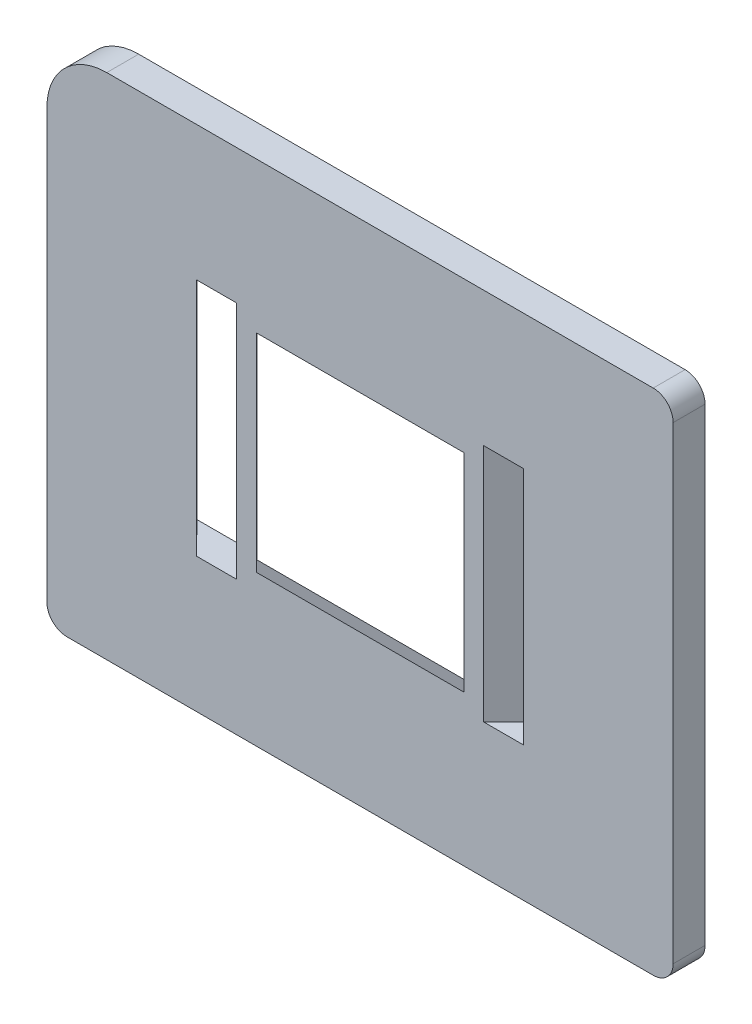
ISO-10303-21;
HEADER;
FILE_DESCRIPTION(('STEP AP214'),'2;1');
FILE_NAME('part.step','',(''),(''),'','','');
FILE_SCHEMA(('AUTOMOTIVE_DESIGN { 1 0 10303 214 1 1 1 1 }'));
ENDSEC;
DATA;
#1=APPLICATION_CONTEXT('core data for automotive mechanical design processes');
#2=APPLICATION_PROTOCOL_DEFINITION('international standard','automotive_design',2000,#1);
#3=PRODUCT_CONTEXT('',#1,'mechanical');
#4=PRODUCT('Part','Part','',(#3));
#5=PRODUCT_RELATED_PRODUCT_CATEGORY('part','',(#4));
#6=PRODUCT_DEFINITION_FORMATION('','',#4);
#7=PRODUCT_DEFINITION_CONTEXT('part definition',#1,'design');
#8=PRODUCT_DEFINITION('design','',#6,#7);
#9=PRODUCT_DEFINITION_SHAPE('','',#8);
#10=(LENGTH_UNIT() NAMED_UNIT(*) SI_UNIT(.MILLI.,.METRE.));
#11=(NAMED_UNIT(*) PLANE_ANGLE_UNIT() SI_UNIT($,.RADIAN.));
#12=(NAMED_UNIT(*) SI_UNIT($,.STERADIAN.) SOLID_ANGLE_UNIT());
#13=UNCERTAINTY_MEASURE_WITH_UNIT(LENGTH_MEASURE(1.E-05),#10,'distance_accuracy_value','');
#14=(GEOMETRIC_REPRESENTATION_CONTEXT(3) GLOBAL_UNCERTAINTY_ASSIGNED_CONTEXT((#13)) GLOBAL_UNIT_ASSIGNED_CONTEXT((#10,
#11,#12)) REPRESENTATION_CONTEXT('',''));
#15=CARTESIAN_POINT('',(0.,0.,0.));
#16=DIRECTION('',(0.,0.,1.));
#17=DIRECTION('',(1.,0.,0.));
#18=AXIS2_PLACEMENT_3D('',#15,#16,#17);
#19=CARTESIAN_POINT('',(0.,0.,4.));
#20=DIRECTION('',(0.,0.,-1.));
#21=DIRECTION('',(-1.,0.,0.));
#22=AXIS2_PLACEMENT_3D('',#19,#20,#21);
#23=PLANE('',#22);
#24=DIRECTION('',(-1.,0.,0.));
#25=VECTOR('',#24,1.);
#26=CARTESIAN_POINT('',(-31.,30.,4.));
#27=LINE('',#26,#25);
#28=CARTESIAN_POINT('',(-31.,30.,4.));
#29=VERTEX_POINT('',#28);
#30=CARTESIAN_POINT('',(-41.,30.,4.));
#31=VERTEX_POINT('',#30);
#32=EDGE_CURVE('E325',#29,#31,#27,.T.);
#33=ORIENTED_EDGE('',*,*,#32,.F.);
#34=DIRECTION('',(0.,1.,0.));
#35=VECTOR('',#34,1.);
#36=CARTESIAN_POINT('',(-31.,30.,4.));
#37=LINE('',#36,#35);
#38=CARTESIAN_POINT('',(-31.,-30.,4.));
#39=VERTEX_POINT('',#38);
#40=EDGE_CURVE('E319',#39,#29,#37,.T.);
#41=ORIENTED_EDGE('',*,*,#40,.F.);
#42=DIRECTION('',(1.,0.,0.));
#43=VECTOR('',#42,1.);
#44=CARTESIAN_POINT('',(-31.,-30.,4.));
#45=LINE('',#44,#43);
#46=CARTESIAN_POINT('',(-41.,-30.,4.));
#47=VERTEX_POINT('',#46);
#48=EDGE_CURVE('E316',#47,#39,#45,.T.);
#49=ORIENTED_EDGE('',*,*,#48,.F.);
#50=DIRECTION('',(0.,-1.,0.));
#51=VECTOR('',#50,1.);
#52=CARTESIAN_POINT('',(-41.,30.,4.));
#53=LINE('',#52,#51);
#54=EDGE_CURVE('E318',#31,#47,#53,.T.);
#55=ORIENTED_EDGE('',*,*,#54,.F.);
#56=EDGE_LOOP('',(#33,#41,#49,#55));
#57=FACE_BOUND('',#56,.T.);
#58=DIRECTION('',(1.,0.,0.));
#59=VECTOR('',#58,1.);
#60=CARTESIAN_POINT('',(-26.,-26.,4.));
#61=LINE('',#60,#59);
#62=CARTESIAN_POINT('',(-26.,-26.,4.));
#63=VERTEX_POINT('',#62);
#64=CARTESIAN_POINT('',(26.,-26.,4.));
#65=VERTEX_POINT('',#64);
#66=EDGE_CURVE('E591',#63,#65,#61,.T.);
#67=ORIENTED_EDGE('',*,*,#66,.F.);
#68=DIRECTION('',(0.,-1.,0.));
#69=VECTOR('',#68,1.);
#70=CARTESIAN_POINT('',(-26.,-26.,4.));
#71=LINE('',#70,#69);
#72=CARTESIAN_POINT('',(-26.,26.,4.));
#73=VERTEX_POINT('',#72);
#74=EDGE_CURVE('E536',#73,#63,#71,.T.);
#75=ORIENTED_EDGE('',*,*,#74,.F.);
#76=DIRECTION('',(-1.,0.,0.));
#77=VECTOR('',#76,1.);
#78=CARTESIAN_POINT('',(-26.,26.,4.));
#79=LINE('',#78,#77);
#80=CARTESIAN_POINT('',(26.,26.,4.));
#81=VERTEX_POINT('',#80);
#82=EDGE_CURVE('E569',#81,#73,#79,.T.);
#83=ORIENTED_EDGE('',*,*,#82,.F.);
#84=DIRECTION('',(0.,1.,0.));
#85=VECTOR('',#84,1.);
#86=CARTESIAN_POINT('',(26.,-26.,4.));
#87=LINE('',#86,#85);
#88=EDGE_CURVE('E566',#65,#81,#87,.T.);
#89=ORIENTED_EDGE('',*,*,#88,.F.);
#90=EDGE_LOOP('',(#67,#75,#83,#89));
#91=FACE_BOUND('',#90,.T.);
#92=DIRECTION('',(0.,-1.,0.));
#93=VECTOR('',#92,1.);
#94=CARTESIAN_POINT('',(-78.5,-63.75,4.));
#95=LINE('',#94,#93);
#96=CARTESIAN_POINT('',(-78.5,48.75,4.));
#97=VERTEX_POINT('',#96);
#98=CARTESIAN_POINT('',(-78.5,-58.75,4.));
#99=VERTEX_POINT('',#98);
#100=EDGE_CURVE('E622',#97,#99,#95,.T.);
#101=ORIENTED_EDGE('',*,*,#100,.T.);
#102=CARTESIAN_POINT('',(-73.5,-58.75,4.));
#103=DIRECTION('',(0.,0.,-1.));
#104=DIRECTION('',(-1.,0.,0.));
#105=AXIS2_PLACEMENT_3D('',#102,#103,#104);
#106=CIRCLE('',#105,5.);
#107=CARTESIAN_POINT('',(-73.5,-63.75,4.));
#108=VERTEX_POINT('',#107);
#109=EDGE_CURVE('E666',#99,#108,#106,.F.);
#110=ORIENTED_EDGE('',*,*,#109,.T.);
#111=DIRECTION('',(1.,0.,0.));
#112=VECTOR('',#111,1.);
#113=CARTESIAN_POINT('',(-78.5,-63.75,4.));
#114=LINE('',#113,#112);
#115=CARTESIAN_POINT('',(73.5,-63.75,4.));
#116=VERTEX_POINT('',#115);
#117=EDGE_CURVE('E585',#108,#116,#114,.T.);
#118=ORIENTED_EDGE('',*,*,#117,.T.);
#119=CARTESIAN_POINT('',(73.5,-58.75,4.));
#120=DIRECTION('',(0.,0.,-1.));
#121=DIRECTION('',(-1.,0.,0.));
#122=AXIS2_PLACEMENT_3D('',#119,#120,#121);
#123=CIRCLE('',#122,5.);
#124=CARTESIAN_POINT('',(78.5,-58.75,4.));
#125=VERTEX_POINT('',#124);
#126=EDGE_CURVE('E647',#116,#125,#123,.F.);
#127=ORIENTED_EDGE('',*,*,#126,.T.);
#128=DIRECTION('',(0.,1.,0.));
#129=VECTOR('',#128,1.);
#130=CARTESIAN_POINT('',(78.5,-63.75,4.));
#131=LINE('',#130,#129);
#132=CARTESIAN_POINT('',(78.5,58.75,4.));
#133=VERTEX_POINT('',#132);
#134=EDGE_CURVE('E617',#125,#133,#131,.T.);
#135=ORIENTED_EDGE('',*,*,#134,.T.);
#136=CARTESIAN_POINT('',(73.5,58.75,4.));
#137=DIRECTION('',(0.,0.,-1.));
#138=DIRECTION('',(-1.,0.,0.));
#139=AXIS2_PLACEMENT_3D('',#136,#137,#138);
#140=CIRCLE('',#139,5.);
#141=CARTESIAN_POINT('',(73.5,63.75,4.));
#142=VERTEX_POINT('',#141);
#143=EDGE_CURVE('E82',#133,#142,#140,.F.);
#144=ORIENTED_EDGE('',*,*,#143,.T.);
#145=DIRECTION('',(-1.,0.,0.));
#146=VECTOR('',#145,1.);
#147=CARTESIAN_POINT('',(-78.5,63.75,4.));
#148=LINE('',#147,#146);
#149=CARTESIAN_POINT('',(-63.5,63.75,4.));
#150=VERTEX_POINT('',#149);
#151=EDGE_CURVE('E619',#142,#150,#148,.T.);
#152=ORIENTED_EDGE('',*,*,#151,.T.);
#153=CARTESIAN_POINT('',(-63.5,48.75,4.));
#154=DIRECTION('',(0.,0.,-1.));
#155=DIRECTION('',(-1.,0.,0.));
#156=AXIS2_PLACEMENT_3D('',#153,#154,#155);
#157=CIRCLE('',#156,15.);
#158=EDGE_CURVE('E662',#150,#97,#157,.F.);
#159=ORIENTED_EDGE('',*,*,#158,.T.);
#160=EDGE_LOOP('',(#101,#110,#118,#127,#135,#144,#152,#159));
#161=FACE_BOUND('',#160,.T.);
#162=DIRECTION('',(1.,0.,0.));
#163=VECTOR('',#162,1.);
#164=CARTESIAN_POINT('',(31.,30.,4.));
#165=LINE('',#164,#163);
#166=CARTESIAN_POINT('',(31.,30.,4.));
#167=VERTEX_POINT('',#166);
#168=CARTESIAN_POINT('',(41.,30.,4.));
#169=VERTEX_POINT('',#168);
#170=EDGE_CURVE('E215',#167,#169,#165,.T.);
#171=ORIENTED_EDGE('',*,*,#170,.T.);
#172=DIRECTION('',(0.,-1.,0.));
#173=VECTOR('',#172,1.);
#174=CARTESIAN_POINT('',(41.,30.,4.));
#175=LINE('',#174,#173);
#176=CARTESIAN_POINT('',(41.,-30.,4.));
#177=VERTEX_POINT('',#176);
#178=EDGE_CURVE('E221',#169,#177,#175,.T.);
#179=ORIENTED_EDGE('',*,*,#178,.T.);
#180=DIRECTION('',(-1.,0.,0.));
#181=VECTOR('',#180,1.);
#182=CARTESIAN_POINT('',(31.,-30.,4.));
#183=LINE('',#182,#181);
#184=CARTESIAN_POINT('',(31.,-30.,4.));
#185=VERTEX_POINT('',#184);
#186=EDGE_CURVE('E226',#177,#185,#183,.T.);
#187=ORIENTED_EDGE('',*,*,#186,.T.);
#188=DIRECTION('',(0.,1.,0.));
#189=VECTOR('',#188,1.);
#190=CARTESIAN_POINT('',(31.,30.,4.));
#191=LINE('',#190,#189);
#192=EDGE_CURVE('E202',#185,#167,#191,.T.);
#193=ORIENTED_EDGE('',*,*,#192,.T.);
#194=EDGE_LOOP('',(#171,#179,#187,#193));
#195=FACE_BOUND('',#194,.T.);
#196=ADVANCED_FACE('F61',(#57,#91,#161,#195),#23,.F.);
#197=CARTESIAN_POINT('',(0.,0.,-4.));
#198=DIRECTION('',(0.,0.,-1.));
#199=DIRECTION('',(-1.,0.,0.));
#200=AXIS2_PLACEMENT_3D('',#197,#198,#199);
#201=PLANE('',#200);
#202=DIRECTION('',(0.,-1.,0.));
#203=VECTOR('',#202,1.);
#204=CARTESIAN_POINT('',(-38.8947368421052,30.,-4.));
#205=LINE('',#204,#203);
#206=CARTESIAN_POINT('',(-38.8947368421052,30.,-4.));
#207=VERTEX_POINT('',#206);
#208=CARTESIAN_POINT('',(-38.8947368421052,-30.,-4.));
#209=VERTEX_POINT('',#208);
#210=EDGE_CURVE('E220',#207,#209,#205,.T.);
#211=ORIENTED_EDGE('',*,*,#210,.F.);
#212=DIRECTION('',(1.,0.,0.));
#213=VECTOR('',#212,1.);
#214=CARTESIAN_POINT('',(-38.8947368421052,30.,-4.));
#215=LINE('',#214,#213);
#216=CARTESIAN_POINT('',(-48.8947368421052,30.,-4.));
#217=VERTEX_POINT('',#216);
#218=EDGE_CURVE('E302',#217,#207,#215,.T.);
#219=ORIENTED_EDGE('',*,*,#218,.F.);
#220=DIRECTION('',(0.,1.,0.));
#221=VECTOR('',#220,1.);
#222=CARTESIAN_POINT('',(-48.8947368421052,30.,-4.));
#223=LINE('',#222,#221);
#224=CARTESIAN_POINT('',(-48.8947368421052,-30.,-4.));
#225=VERTEX_POINT('',#224);
#226=EDGE_CURVE('E296',#225,#217,#223,.T.);
#227=ORIENTED_EDGE('',*,*,#226,.F.);
#228=DIRECTION('',(-1.,0.,0.));
#229=VECTOR('',#228,1.);
#230=CARTESIAN_POINT('',(-38.8947368421052,-30.,-4.));
#231=LINE('',#230,#229);
#232=EDGE_CURVE('E288',#209,#225,#231,.T.);
#233=ORIENTED_EDGE('',*,*,#232,.F.);
#234=EDGE_LOOP('',(#211,#219,#227,#233));
#235=FACE_BOUND('',#234,.T.);
#236=DIRECTION('',(0.,1.,0.));
#237=VECTOR('',#236,1.);
#238=CARTESIAN_POINT('',(-33.8947368421053,0.,-4.));
#239=LINE('',#238,#237);
#240=CARTESIAN_POINT('',(-33.8947368421052,-31.221052631579,-4.));
#241=VERTEX_POINT('',#240);
#242=CARTESIAN_POINT('',(-33.8947368421053,31.2210526315789,-4.));
#243=VERTEX_POINT('',#242);
#244=EDGE_CURVE('E580',#241,#243,#239,.T.);
#245=ORIENTED_EDGE('',*,*,#244,.F.);
#246=DIRECTION('',(-1.,0.,0.));
#247=VECTOR('',#246,1.);
#248=CARTESIAN_POINT('',(0.,-31.221052631579,-4.));
#249=LINE('',#248,#247);
#250=CARTESIAN_POINT('',(33.8947368421053,-31.2210526315789,-4.));
#251=VERTEX_POINT('',#250);
#252=EDGE_CURVE('E582',#251,#241,#249,.T.);
#253=ORIENTED_EDGE('',*,*,#252,.F.);
#254=DIRECTION('',(0.,-1.,0.));
#255=VECTOR('',#254,1.);
#256=CARTESIAN_POINT('',(33.8947368421053,0.,-4.));
#257=LINE('',#256,#255);
#258=CARTESIAN_POINT('',(33.8947368421053,31.221052631579,-4.));
#259=VERTEX_POINT('',#258);
#260=EDGE_CURVE('E581',#259,#251,#257,.T.);
#261=ORIENTED_EDGE('',*,*,#260,.F.);
#262=DIRECTION('',(1.,0.,0.));
#263=VECTOR('',#262,1.);
#264=CARTESIAN_POINT('',(0.,31.2210526315789,-4.));
#265=LINE('',#264,#263);
#266=EDGE_CURVE('E575',#243,#259,#265,.T.);
#267=ORIENTED_EDGE('',*,*,#266,.F.);
#268=EDGE_LOOP('',(#245,#253,#261,#267));
#269=FACE_BOUND('',#268,.T.);
#270=DIRECTION('',(1.,0.,0.));
#271=VECTOR('',#270,1.);
#272=CARTESIAN_POINT('',(-78.5,-63.75,-4.));
#273=LINE('',#272,#271);
#274=CARTESIAN_POINT('',(-73.5,-63.75,-4.));
#275=VERTEX_POINT('',#274);
#276=CARTESIAN_POINT('',(73.5,-63.75,-4.));
#277=VERTEX_POINT('',#276);
#278=EDGE_CURVE('E620',#275,#277,#273,.T.);
#279=ORIENTED_EDGE('',*,*,#278,.F.);
#280=CARTESIAN_POINT('',(-73.5,-58.75,-4.));
#281=DIRECTION('',(0.,0.,-1.));
#282=DIRECTION('',(-1.,0.,0.));
#283=AXIS2_PLACEMENT_3D('',#280,#281,#282);
#284=CIRCLE('',#283,5.);
#285=CARTESIAN_POINT('',(-78.5,-58.75,-4.));
#286=VERTEX_POINT('',#285);
#287=EDGE_CURVE('E655',#275,#286,#284,.T.);
#288=ORIENTED_EDGE('',*,*,#287,.T.);
#289=DIRECTION('',(0.,-1.,0.));
#290=VECTOR('',#289,1.);
#291=CARTESIAN_POINT('',(-78.5,-63.75,-4.));
#292=LINE('',#291,#290);
#293=CARTESIAN_POINT('',(-78.5,48.75,-4.));
#294=VERTEX_POINT('',#293);
#295=EDGE_CURVE('E631',#294,#286,#292,.T.);
#296=ORIENTED_EDGE('',*,*,#295,.F.);
#297=CARTESIAN_POINT('',(-63.5,48.75,-4.));
#298=DIRECTION('',(0.,0.,-1.));
#299=DIRECTION('',(-1.,0.,0.));
#300=AXIS2_PLACEMENT_3D('',#297,#298,#299);
#301=CIRCLE('',#300,15.);
#302=CARTESIAN_POINT('',(-63.5,63.75,-4.));
#303=VERTEX_POINT('',#302);
#304=EDGE_CURVE('E648',#294,#303,#301,.T.);
#305=ORIENTED_EDGE('',*,*,#304,.T.);
#306=DIRECTION('',(-1.,0.,0.));
#307=VECTOR('',#306,1.);
#308=CARTESIAN_POINT('',(-78.5,63.75,-4.));
#309=LINE('',#308,#307);
#310=CARTESIAN_POINT('',(73.5,63.75,-4.));
#311=VERTEX_POINT('',#310);
#312=EDGE_CURVE('E629',#311,#303,#309,.T.);
#313=ORIENTED_EDGE('',*,*,#312,.F.);
#314=CARTESIAN_POINT('',(73.5,58.75,-4.));
#315=DIRECTION('',(0.,0.,-1.));
#316=DIRECTION('',(-1.,0.,0.));
#317=AXIS2_PLACEMENT_3D('',#314,#315,#316);
#318=CIRCLE('',#317,5.);
#319=CARTESIAN_POINT('',(78.5,58.75,-4.));
#320=VERTEX_POINT('',#319);
#321=EDGE_CURVE('E652',#311,#320,#318,.T.);
#322=ORIENTED_EDGE('',*,*,#321,.T.);
#323=DIRECTION('',(0.,1.,0.));
#324=VECTOR('',#323,1.);
#325=CARTESIAN_POINT('',(78.5,-63.75,-4.));
#326=LINE('',#325,#324);
#327=CARTESIAN_POINT('',(78.5,-58.75,-4.));
#328=VERTEX_POINT('',#327);
#329=EDGE_CURVE('E612',#328,#320,#326,.T.);
#330=ORIENTED_EDGE('',*,*,#329,.F.);
#331=CARTESIAN_POINT('',(73.5,-58.75,-4.));
#332=DIRECTION('',(0.,0.,-1.));
#333=DIRECTION('',(-1.,0.,0.));
#334=AXIS2_PLACEMENT_3D('',#331,#332,#333);
#335=CIRCLE('',#334,5.);
#336=EDGE_CURVE('E645',#328,#277,#335,.T.);
#337=ORIENTED_EDGE('',*,*,#336,.T.);
#338=EDGE_LOOP('',(#279,#288,#296,#305,#313,#322,#330,#337));
#339=FACE_BOUND('',#338,.T.);
#340=DIRECTION('',(0.,1.,0.));
#341=VECTOR('',#340,1.);
#342=CARTESIAN_POINT('',(48.8947368421052,30.,-4.));
#343=LINE('',#342,#341);
#344=CARTESIAN_POINT('',(48.8947368421052,-30.,-4.));
#345=VERTEX_POINT('',#344);
#346=CARTESIAN_POINT('',(48.8947368421052,30.,-4.));
#347=VERTEX_POINT('',#346);
#348=EDGE_CURVE('E433',#345,#347,#343,.T.);
#349=ORIENTED_EDGE('',*,*,#348,.T.);
#350=DIRECTION('',(-1.,0.,0.));
#351=VECTOR('',#350,1.);
#352=CARTESIAN_POINT('',(38.8947368421052,30.,-4.));
#353=LINE('',#352,#351);
#354=CARTESIAN_POINT('',(38.8947368421052,30.,-4.));
#355=VERTEX_POINT('',#354);
#356=EDGE_CURVE('E485',#347,#355,#353,.T.);
#357=ORIENTED_EDGE('',*,*,#356,.T.);
#358=DIRECTION('',(0.,-1.,0.));
#359=VECTOR('',#358,1.);
#360=CARTESIAN_POINT('',(38.8947368421052,30.,-4.));
#361=LINE('',#360,#359);
#362=CARTESIAN_POINT('',(38.8947368421052,-30.,-4.));
#363=VERTEX_POINT('',#362);
#364=EDGE_CURVE('E206',#355,#363,#361,.T.);
#365=ORIENTED_EDGE('',*,*,#364,.T.);
#366=DIRECTION('',(1.,0.,0.));
#367=VECTOR('',#366,1.);
#368=CARTESIAN_POINT('',(38.8947368421052,-30.,-4.));
#369=LINE('',#368,#367);
#370=EDGE_CURVE('E432',#363,#345,#369,.T.);
#371=ORIENTED_EDGE('',*,*,#370,.T.);
#372=EDGE_LOOP('',(#349,#357,#365,#371));
#373=FACE_BOUND('',#372,.T.);
#374=ADVANCED_FACE('F247',(#235,#269,#339,#373),#201,.T.);
#375=CARTESIAN_POINT('',(78.5,-63.75,4.));
#376=DIRECTION('',(-1.,0.,0.));
#377=DIRECTION('',(0.,0.,1.));
#378=AXIS2_PLACEMENT_3D('',#375,#376,#377);
#379=PLANE('',#378);
#380=ORIENTED_EDGE('',*,*,#134,.F.);
#381=DIRECTION('',(0.,0.,-1.));
#382=VECTOR('',#381,1.);
#383=CARTESIAN_POINT('',(78.5,-58.75,4.));
#384=LINE('',#383,#382);
#385=EDGE_CURVE('E670',#125,#328,#384,.T.);
#386=ORIENTED_EDGE('',*,*,#385,.T.);
#387=ORIENTED_EDGE('',*,*,#329,.T.);
#388=DIRECTION('',(0.,0.,-1.));
#389=VECTOR('',#388,1.);
#390=CARTESIAN_POINT('',(78.5,58.75,4.));
#391=LINE('',#390,#389);
#392=EDGE_CURVE('E668',#320,#133,#391,.F.);
#393=ORIENTED_EDGE('',*,*,#392,.T.);
#394=EDGE_LOOP('',(#380,#386,#387,#393));
#395=FACE_BOUND('',#394,.T.);
#396=ADVANCED_FACE('F674',(#395),#379,.F.);
#397=CARTESIAN_POINT('',(-78.5,63.75,4.));
#398=DIRECTION('',(0.,-1.,0.));
#399=DIRECTION('',(0.,0.,-1.));
#400=AXIS2_PLACEMENT_3D('',#397,#398,#399);
#401=PLANE('',#400);
#402=ORIENTED_EDGE('',*,*,#151,.F.);
#403=DIRECTION('',(0.,0.,-1.));
#404=VECTOR('',#403,1.);
#405=CARTESIAN_POINT('',(73.5,63.75,4.));
#406=LINE('',#405,#404);
#407=EDGE_CURVE('E13',#142,#311,#406,.T.);
#408=ORIENTED_EDGE('',*,*,#407,.T.);
#409=ORIENTED_EDGE('',*,*,#312,.T.);
#410=DIRECTION('',(0.,0.,-1.));
#411=VECTOR('',#410,1.);
#412=CARTESIAN_POINT('',(-63.5,63.75,4.));
#413=LINE('',#412,#411);
#414=EDGE_CURVE('E69',#303,#150,#413,.F.);
#415=ORIENTED_EDGE('',*,*,#414,.T.);
#416=EDGE_LOOP('',(#402,#408,#409,#415));
#417=FACE_BOUND('',#416,.T.);
#418=ADVANCED_FACE('F680',(#417),#401,.F.);
#419=CARTESIAN_POINT('',(-78.5,-63.75,4.));
#420=DIRECTION('',(1.,0.,0.));
#421=DIRECTION('',(0.,0.,-1.));
#422=AXIS2_PLACEMENT_3D('',#419,#420,#421);
#423=PLANE('',#422);
#424=ORIENTED_EDGE('',*,*,#295,.T.);
#425=DIRECTION('',(0.,0.,-1.));
#426=VECTOR('',#425,1.);
#427=CARTESIAN_POINT('',(-78.5,-58.75,4.));
#428=LINE('',#427,#426);
#429=EDGE_CURVE('E660',#286,#99,#428,.F.);
#430=ORIENTED_EDGE('',*,*,#429,.T.);
#431=ORIENTED_EDGE('',*,*,#100,.F.);
#432=DIRECTION('',(0.,0.,-1.));
#433=VECTOR('',#432,1.);
#434=CARTESIAN_POINT('',(-78.5,48.75,4.));
#435=LINE('',#434,#433);
#436=EDGE_CURVE('E657',#97,#294,#435,.T.);
#437=ORIENTED_EDGE('',*,*,#436,.T.);
#438=EDGE_LOOP('',(#424,#430,#431,#437));
#439=FACE_BOUND('',#438,.T.);
#440=ADVANCED_FACE('F687',(#439),#423,.F.);
#441=CARTESIAN_POINT('',(-78.5,-63.75,4.));
#442=DIRECTION('',(0.,1.,0.));
#443=DIRECTION('',(0.,0.,1.));
#444=AXIS2_PLACEMENT_3D('',#441,#442,#443);
#445=PLANE('',#444);
#446=ORIENTED_EDGE('',*,*,#117,.F.);
#447=DIRECTION('',(0.,0.,-1.));
#448=VECTOR('',#447,1.);
#449=CARTESIAN_POINT('',(-73.5,-63.75,4.));
#450=LINE('',#449,#448);
#451=EDGE_CURVE('E640',#108,#275,#450,.T.);
#452=ORIENTED_EDGE('',*,*,#451,.T.);
#453=ORIENTED_EDGE('',*,*,#278,.T.);
#454=DIRECTION('',(0.,0.,-1.));
#455=VECTOR('',#454,1.);
#456=CARTESIAN_POINT('',(73.5,-63.75,4.));
#457=LINE('',#456,#455);
#458=EDGE_CURVE('E589',#277,#116,#457,.F.);
#459=ORIENTED_EDGE('',*,*,#458,.T.);
#460=EDGE_LOOP('',(#446,#452,#453,#459));
#461=FACE_BOUND('',#460,.T.);
#462=ADVANCED_FACE('F553',(#461),#445,.F.);
#463=CARTESIAN_POINT('',(-15.1720024559249,0.,14.9723708446627));
#464=DIRECTION('',(-0.711773999328801,0.,0.702408551969211));
#465=DIRECTION('',(0.702408551969211,0.,0.711773999328801));
#466=AXIS2_PLACEMENT_3D('',#463,#464,#465);
#467=PLANE('',#466);
#468=ORIENTED_EDGE('',*,*,#244,.T.);
#469=DIRECTION('',(-0.637032331936134,0.421290715520429,-0.645526096361949));
#470=VECTOR('',#469,1.);
#471=CARTESIAN_POINT('',(-26.,26.,4.));
#472=LINE('',#471,#470);
#473=EDGE_CURVE('E523',#73,#243,#472,.T.);
#474=ORIENTED_EDGE('',*,*,#473,.F.);
#475=ORIENTED_EDGE('',*,*,#74,.T.);
#476=DIRECTION('',(-0.637032331936134,-0.42129071552043,-0.645526096361949));
#477=VECTOR('',#476,1.);
#478=CARTESIAN_POINT('',(-26.,-26.,4.));
#479=LINE('',#478,#477);
#480=EDGE_CURVE('E560',#63,#241,#479,.T.);
#481=ORIENTED_EDGE('',*,*,#480,.T.);
#482=EDGE_LOOP('',(#468,#474,#475,#481));
#483=FACE_BOUND('',#482,.T.);
#484=ADVANCED_FACE('F543',(#483),#467,.F.);
#485=CARTESIAN_POINT('',(0.,-20.0644960758412,13.0947237547595));
#486=DIRECTION('',(0.,-0.837435186822461,0.546536648242027));
#487=DIRECTION('',(0.,-0.546536648242027,-0.837435186822461));
#488=AXIS2_PLACEMENT_3D('',#485,#486,#487);
#489=PLANE('',#488);
#490=ORIENTED_EDGE('',*,*,#252,.T.);
#491=ORIENTED_EDGE('',*,*,#480,.F.);
#492=ORIENTED_EDGE('',*,*,#66,.T.);
#493=DIRECTION('',(0.637032331936134,-0.42129071552043,-0.645526096361949));
#494=VECTOR('',#493,1.);
#495=CARTESIAN_POINT('',(26.,-26.,4.));
#496=LINE('',#495,#494);
#497=EDGE_CURVE('E517',#65,#251,#496,.T.);
#498=ORIENTED_EDGE('',*,*,#497,.T.);
#499=EDGE_LOOP('',(#490,#491,#492,#498));
#500=FACE_BOUND('',#499,.T.);
#501=ADVANCED_FACE('F552',(#500),#489,.F.);
#502=CARTESIAN_POINT('',(0.,20.0644960758412,13.0947237547595));
#503=DIRECTION('',(0.,0.837435186822461,0.546536648242027));
#504=DIRECTION('',(0.,-0.546536648242027,0.837435186822461));
#505=AXIS2_PLACEMENT_3D('',#502,#503,#504);
#506=PLANE('',#505);
#507=ORIENTED_EDGE('',*,*,#266,.T.);
#508=DIRECTION('',(0.637032331936134,0.42129071552043,-0.645526096361949));
#509=VECTOR('',#508,1.);
#510=CARTESIAN_POINT('',(26.,26.,4.));
#511=LINE('',#510,#509);
#512=EDGE_CURVE('E519',#81,#259,#511,.T.);
#513=ORIENTED_EDGE('',*,*,#512,.F.);
#514=ORIENTED_EDGE('',*,*,#82,.T.);
#515=ORIENTED_EDGE('',*,*,#473,.T.);
#516=EDGE_LOOP('',(#507,#513,#514,#515));
#517=FACE_BOUND('',#516,.T.);
#518=ADVANCED_FACE('F556',(#517),#506,.F.);
#519=CARTESIAN_POINT('',(15.1720024559249,0.,14.9723708446628));
#520=DIRECTION('',(0.711773999328801,0.,0.702408551969211));
#521=DIRECTION('',(0.702408551969211,0.,-0.711773999328801));
#522=AXIS2_PLACEMENT_3D('',#519,#520,#521);
#523=PLANE('',#522);
#524=ORIENTED_EDGE('',*,*,#260,.T.);
#525=ORIENTED_EDGE('',*,*,#497,.F.);
#526=ORIENTED_EDGE('',*,*,#88,.T.);
#527=ORIENTED_EDGE('',*,*,#512,.T.);
#528=EDGE_LOOP('',(#524,#525,#526,#527));
#529=FACE_BOUND('',#528,.T.);
#530=ADVANCED_FACE('F249',(#529),#523,.F.);
#531=CARTESIAN_POINT('',(0.,30.,0.));
#532=DIRECTION('',(0.,-1.,0.));
#533=DIRECTION('',(0.,0.,-1.));
#534=AXIS2_PLACEMENT_3D('',#531,#532,#533);
#535=PLANE('',#534);
#536=DIRECTION('',(-0.702408551969211,0.,-0.711773999328801));
#537=VECTOR('',#536,1.);
#538=CARTESIAN_POINT('',(-31.,30.,4.));
#539=LINE('',#538,#537);
#540=EDGE_CURVE('E377',#29,#207,#539,.T.);
#541=ORIENTED_EDGE('',*,*,#540,.F.);
#542=ORIENTED_EDGE('',*,*,#32,.T.);
#543=DIRECTION('',(-0.702408551969211,0.,-0.711773999328801));
#544=VECTOR('',#543,1.);
#545=CARTESIAN_POINT('',(-41.,30.,4.));
#546=LINE('',#545,#544);
#547=EDGE_CURVE('E324',#31,#217,#546,.T.);
#548=ORIENTED_EDGE('',*,*,#547,.T.);
#549=ORIENTED_EDGE('',*,*,#218,.T.);
#550=EDGE_LOOP('',(#541,#542,#548,#549));
#551=FACE_BOUND('',#550,.T.);
#552=ADVANCED_FACE('F345',(#551),#535,.T.);
#553=CARTESIAN_POINT('',(-22.7713358477327,0.,22.4717130076309));
#554=DIRECTION('',(0.711773999328801,0.,-0.702408551969211));
#555=DIRECTION('',(-0.702408551969211,0.,-0.711773999328801));
#556=AXIS2_PLACEMENT_3D('',#553,#554,#555);
#557=PLANE('',#556);
#558=ORIENTED_EDGE('',*,*,#547,.F.);
#559=ORIENTED_EDGE('',*,*,#54,.T.);
#560=DIRECTION('',(-0.702408551969211,0.,-0.711773999328801));
#561=VECTOR('',#560,1.);
#562=CARTESIAN_POINT('',(-41.,-30.,4.));
#563=LINE('',#562,#561);
#564=EDGE_CURVE('E386',#47,#225,#563,.T.);
#565=ORIENTED_EDGE('',*,*,#564,.T.);
#566=ORIENTED_EDGE('',*,*,#226,.T.);
#567=EDGE_LOOP('',(#558,#559,#565,#566));
#568=FACE_BOUND('',#567,.T.);
#569=ADVANCED_FACE('F334',(#568),#557,.T.);
#570=CARTESIAN_POINT('',(-17.7051135865275,0.,17.4721515656521));
#571=DIRECTION('',(-0.711773999328801,0.,0.702408551969211));
#572=DIRECTION('',(0.702408551969211,0.,0.711773999328801));
#573=AXIS2_PLACEMENT_3D('',#570,#571,#572);
#574=PLANE('',#573);
#575=DIRECTION('',(-0.702408551969211,0.,-0.711773999328801));
#576=VECTOR('',#575,1.);
#577=CARTESIAN_POINT('',(-31.,-30.,4.));
#578=LINE('',#577,#576);
#579=EDGE_CURVE('E375',#39,#209,#578,.T.);
#580=ORIENTED_EDGE('',*,*,#579,.F.);
#581=ORIENTED_EDGE('',*,*,#40,.T.);
#582=ORIENTED_EDGE('',*,*,#540,.T.);
#583=ORIENTED_EDGE('',*,*,#210,.T.);
#584=EDGE_LOOP('',(#580,#581,#582,#583));
#585=FACE_BOUND('',#584,.T.);
#586=ADVANCED_FACE('F344',(#585),#574,.T.);
#587=CARTESIAN_POINT('',(0.,-30.,0.));
#588=DIRECTION('',(0.,1.,0.));
#589=DIRECTION('',(0.,0.,1.));
#590=AXIS2_PLACEMENT_3D('',#587,#588,#589);
#591=PLANE('',#590);
#592=ORIENTED_EDGE('',*,*,#564,.F.);
#593=ORIENTED_EDGE('',*,*,#48,.T.);
#594=ORIENTED_EDGE('',*,*,#579,.T.);
#595=ORIENTED_EDGE('',*,*,#232,.T.);
#596=EDGE_LOOP('',(#592,#593,#594,#595));
#597=FACE_BOUND('',#596,.T.);
#598=ADVANCED_FACE('F383',(#597),#591,.T.);
#599=CARTESIAN_POINT('',(0.,30.,0.));
#600=DIRECTION('',(0.,-1.,0.));
#601=DIRECTION('',(0.,0.,-1.));
#602=AXIS2_PLACEMENT_3D('',#599,#600,#601);
#603=PLANE('',#602);
#604=DIRECTION('',(0.702408551969211,0.,-0.711773999328801));
#605=VECTOR('',#604,1.);
#606=CARTESIAN_POINT('',(31.,30.,4.));
#607=LINE('',#606,#605);
#608=EDGE_CURVE('E198',#167,#355,#607,.T.);
#609=ORIENTED_EDGE('',*,*,#608,.T.);
#610=ORIENTED_EDGE('',*,*,#356,.F.);
#611=DIRECTION('',(0.702408551969211,0.,-0.711773999328801));
#612=VECTOR('',#611,1.);
#613=CARTESIAN_POINT('',(41.,30.,4.));
#614=LINE('',#613,#612);
#615=EDGE_CURVE('E211',#169,#347,#614,.T.);
#616=ORIENTED_EDGE('',*,*,#615,.F.);
#617=ORIENTED_EDGE('',*,*,#170,.F.);
#618=EDGE_LOOP('',(#609,#610,#616,#617));
#619=FACE_BOUND('',#618,.T.);
#620=ADVANCED_FACE('F216',(#619),#603,.T.);
#621=CARTESIAN_POINT('',(22.7713358477327,0.,22.4717130076309));
#622=DIRECTION('',(-0.711773999328801,0.,-0.702408551969211));
#623=DIRECTION('',(0.702408551969211,0.,-0.711773999328801));
#624=AXIS2_PLACEMENT_3D('',#621,#622,#623);
#625=PLANE('',#624);
#626=ORIENTED_EDGE('',*,*,#615,.T.);
#627=ORIENTED_EDGE('',*,*,#348,.F.);
#628=DIRECTION('',(0.702408551969211,0.,-0.711773999328801));
#629=VECTOR('',#628,1.);
#630=CARTESIAN_POINT('',(41.,-30.,4.));
#631=LINE('',#630,#629);
#632=EDGE_CURVE('E482',#177,#345,#631,.T.);
#633=ORIENTED_EDGE('',*,*,#632,.F.);
#634=ORIENTED_EDGE('',*,*,#178,.F.);
#635=EDGE_LOOP('',(#626,#627,#633,#634));
#636=FACE_BOUND('',#635,.T.);
#637=ADVANCED_FACE('F450',(#636),#625,.T.);
#638=CARTESIAN_POINT('',(17.7051135865275,0.,17.4721515656521));
#639=DIRECTION('',(0.711773999328801,0.,0.702408551969211));
#640=DIRECTION('',(-0.702408551969211,0.,0.711773999328801));
#641=AXIS2_PLACEMENT_3D('',#638,#639,#640);
#642=PLANE('',#641);
#643=DIRECTION('',(0.702408551969211,0.,-0.711773999328801));
#644=VECTOR('',#643,1.);
#645=CARTESIAN_POINT('',(31.,-30.,4.));
#646=LINE('',#645,#644);
#647=EDGE_CURVE('E212',#185,#363,#646,.T.);
#648=ORIENTED_EDGE('',*,*,#647,.T.);
#649=ORIENTED_EDGE('',*,*,#364,.F.);
#650=ORIENTED_EDGE('',*,*,#608,.F.);
#651=ORIENTED_EDGE('',*,*,#192,.F.);
#652=EDGE_LOOP('',(#648,#649,#650,#651));
#653=FACE_BOUND('',#652,.T.);
#654=ADVANCED_FACE('F200',(#653),#642,.T.);
#655=CARTESIAN_POINT('',(0.,-30.,0.));
#656=DIRECTION('',(0.,1.,0.));
#657=DIRECTION('',(0.,0.,1.));
#658=AXIS2_PLACEMENT_3D('',#655,#656,#657);
#659=PLANE('',#658);
#660=ORIENTED_EDGE('',*,*,#632,.T.);
#661=ORIENTED_EDGE('',*,*,#370,.F.);
#662=ORIENTED_EDGE('',*,*,#647,.F.);
#663=ORIENTED_EDGE('',*,*,#186,.F.);
#664=EDGE_LOOP('',(#660,#661,#662,#663));
#665=FACE_BOUND('',#664,.T.);
#666=ADVANCED_FACE('F693',(#665),#659,.T.);
#667=CARTESIAN_POINT('',(-73.5,-58.75,4.));
#668=DIRECTION('',(0.,0.,-1.));
#669=DIRECTION('',(-1.,0.,0.));
#670=AXIS2_PLACEMENT_3D('',#667,#668,#669);
#671=CYLINDRICAL_SURFACE('',#670,5.);
#672=ORIENTED_EDGE('',*,*,#109,.F.);
#673=ORIENTED_EDGE('',*,*,#429,.F.);
#674=ORIENTED_EDGE('',*,*,#287,.F.);
#675=ORIENTED_EDGE('',*,*,#451,.F.);
#676=EDGE_LOOP('',(#672,#673,#674,#675));
#677=FACE_BOUND('',#676,.T.);
#678=ADVANCED_FACE('F691',(#677),#671,.T.);
#679=CARTESIAN_POINT('',(73.5,-58.75,4.));
#680=DIRECTION('',(0.,0.,-1.));
#681=DIRECTION('',(-1.,0.,0.));
#682=AXIS2_PLACEMENT_3D('',#679,#680,#681);
#683=CYLINDRICAL_SURFACE('',#682,5.);
#684=ORIENTED_EDGE('',*,*,#126,.F.);
#685=ORIENTED_EDGE('',*,*,#458,.F.);
#686=ORIENTED_EDGE('',*,*,#336,.F.);
#687=ORIENTED_EDGE('',*,*,#385,.F.);
#688=EDGE_LOOP('',(#684,#685,#686,#687));
#689=FACE_BOUND('',#688,.T.);
#690=ADVANCED_FACE('F643',(#689),#683,.T.);
#691=CARTESIAN_POINT('',(73.5,58.75,4.));
#692=DIRECTION('',(0.,0.,-1.));
#693=DIRECTION('',(-1.,0.,0.));
#694=AXIS2_PLACEMENT_3D('',#691,#692,#693);
#695=CYLINDRICAL_SURFACE('',#694,5.);
#696=ORIENTED_EDGE('',*,*,#143,.F.);
#697=ORIENTED_EDGE('',*,*,#392,.F.);
#698=ORIENTED_EDGE('',*,*,#321,.F.);
#699=ORIENTED_EDGE('',*,*,#407,.F.);
#700=EDGE_LOOP('',(#696,#697,#698,#699));
#701=FACE_BOUND('',#700,.T.);
#702=ADVANCED_FACE('F679',(#701),#695,.T.);
#703=CARTESIAN_POINT('',(-63.5,48.75,4.));
#704=DIRECTION('',(0.,0.,-1.));
#705=DIRECTION('',(-1.,0.,0.));
#706=AXIS2_PLACEMENT_3D('',#703,#704,#705);
#707=CYLINDRICAL_SURFACE('',#706,15.);
#708=ORIENTED_EDGE('',*,*,#158,.F.);
#709=ORIENTED_EDGE('',*,*,#414,.F.);
#710=ORIENTED_EDGE('',*,*,#304,.F.);
#711=ORIENTED_EDGE('',*,*,#436,.F.);
#712=EDGE_LOOP('',(#708,#709,#710,#711));
#713=FACE_BOUND('',#712,.T.);
#714=ADVANCED_FACE('F63',(#713),#707,.T.);
#715=CLOSED_SHELL('',(#196,#374,#396,#418,#440,#462,#484,#501,#518,#530,#552,#569,#586,#598,
#620,#637,#654,#666,#678,#690,#702,#714));
#716=MANIFOLD_SOLID_BREP('B2',#715);
#717=ADVANCED_BREP_SHAPE_REPRESENTATION('',(#18,#716),#14);
#718=SHAPE_DEFINITION_REPRESENTATION(#9,#717);
ENDSEC;
END-ISO-10303-21;
